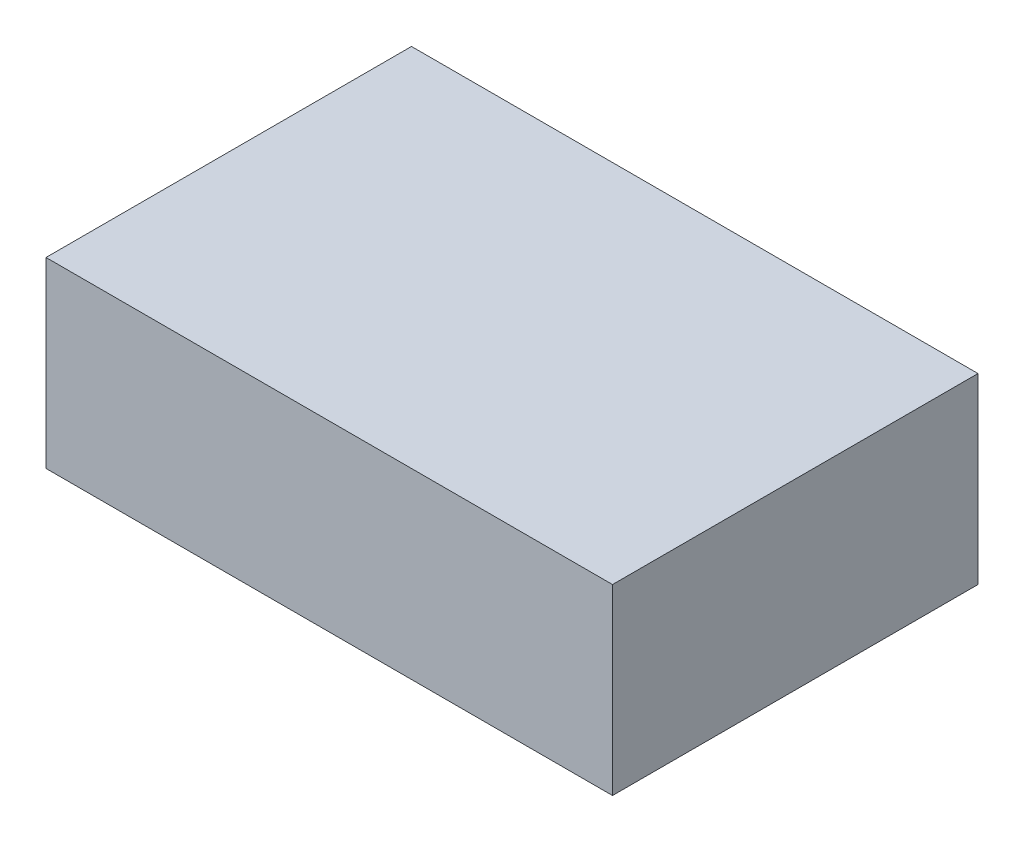
ISO-10303-21;
HEADER;
FILE_DESCRIPTION(('STEP AP214'),'2;1');
FILE_NAME('part.step','',(''),(''),'','','');
FILE_SCHEMA(('AUTOMOTIVE_DESIGN { 1 0 10303 214 1 1 1 1 }'));
ENDSEC;
DATA;
#1=APPLICATION_CONTEXT('core data for automotive mechanical design processes');
#2=APPLICATION_PROTOCOL_DEFINITION('international standard','automotive_design',2000,#1);
#3=PRODUCT_CONTEXT('',#1,'mechanical');
#4=PRODUCT('Part','Part','',(#3));
#5=PRODUCT_RELATED_PRODUCT_CATEGORY('part','',(#4));
#6=PRODUCT_DEFINITION_FORMATION('','',#4);
#7=PRODUCT_DEFINITION_CONTEXT('part definition',#1,'design');
#8=PRODUCT_DEFINITION('design','',#6,#7);
#9=PRODUCT_DEFINITION_SHAPE('','',#8);
#10=(LENGTH_UNIT() NAMED_UNIT(*) SI_UNIT(.MILLI.,.METRE.));
#11=(NAMED_UNIT(*) PLANE_ANGLE_UNIT() SI_UNIT($,.RADIAN.));
#12=(NAMED_UNIT(*) SI_UNIT($,.STERADIAN.) SOLID_ANGLE_UNIT());
#13=UNCERTAINTY_MEASURE_WITH_UNIT(LENGTH_MEASURE(1.E-05),#10,'distance_accuracy_value','');
#14=(GEOMETRIC_REPRESENTATION_CONTEXT(3) GLOBAL_UNCERTAINTY_ASSIGNED_CONTEXT((#13)) GLOBAL_UNIT_ASSIGNED_CONTEXT((#10,
#11,#12)) REPRESENTATION_CONTEXT('',''));
#15=CARTESIAN_POINT('',(0.,0.,0.));
#16=DIRECTION('',(0.,0.,1.));
#17=DIRECTION('',(1.,0.,0.));
#18=AXIS2_PLACEMENT_3D('',#15,#16,#17);
#19=CARTESIAN_POINT('',(0.,-10.,0.));
#20=DIRECTION('',(-1.,0.,0.));
#21=DIRECTION('',(0.,0.,1.));
#22=AXIS2_PLACEMENT_3D('',#19,#20,#21);
#23=PLANE('',#22);
#24=DIRECTION('',(0.,0.,1.));
#25=VECTOR('',#24,1.);
#26=CARTESIAN_POINT('',(0.,0.,0.));
#27=LINE('',#26,#25);
#28=CARTESIAN_POINT('',(0.,0.,-20.));
#29=VERTEX_POINT('',#28);
#30=CARTESIAN_POINT('',(0.,0.,0.));
#31=VERTEX_POINT('',#30);
#32=EDGE_CURVE('E104',#29,#31,#27,.T.);
#33=ORIENTED_EDGE('',*,*,#32,.F.);
#34=DIRECTION('',(0.,1.,0.));
#35=VECTOR('',#34,1.);
#36=CARTESIAN_POINT('',(0.,-10.,-20.));
#37=LINE('',#36,#35);
#38=CARTESIAN_POINT('',(0.,-10.,-20.));
#39=VERTEX_POINT('',#38);
#40=EDGE_CURVE('E11',#39,#29,#37,.T.);
#41=ORIENTED_EDGE('',*,*,#40,.F.);
#42=DIRECTION('',(0.,0.,1.));
#43=VECTOR('',#42,1.);
#44=CARTESIAN_POINT('',(0.,-10.,0.));
#45=LINE('',#44,#43);
#46=CARTESIAN_POINT('',(0.,-10.,0.));
#47=VERTEX_POINT('',#46);
#48=EDGE_CURVE('E100',#39,#47,#45,.T.);
#49=ORIENTED_EDGE('',*,*,#48,.T.);
#50=DIRECTION('',(0.,1.,0.));
#51=VECTOR('',#50,1.);
#52=CARTESIAN_POINT('',(0.,-10.,0.));
#53=LINE('',#52,#51);
#54=EDGE_CURVE('E45',#47,#31,#53,.T.);
#55=ORIENTED_EDGE('',*,*,#54,.T.);
#56=EDGE_LOOP('',(#33,#41,#49,#55));
#57=FACE_BOUND('',#56,.T.);
#58=ADVANCED_FACE('F39',(#57),#23,.T.);
#59=CARTESIAN_POINT('',(0.,-10.,-20.));
#60=DIRECTION('',(0.,0.,-1.));
#61=DIRECTION('',(-1.,0.,0.));
#62=AXIS2_PLACEMENT_3D('',#59,#60,#61);
#63=PLANE('',#62);
#64=DIRECTION('',(-1.,0.,0.));
#65=VECTOR('',#64,1.);
#66=CARTESIAN_POINT('',(0.,0.,-20.));
#67=LINE('',#66,#65);
#68=CARTESIAN_POINT('',(31.,0.,-20.));
#69=VERTEX_POINT('',#68);
#70=EDGE_CURVE('E98',#69,#29,#67,.T.);
#71=ORIENTED_EDGE('',*,*,#70,.F.);
#72=DIRECTION('',(0.,1.,0.));
#73=VECTOR('',#72,1.);
#74=CARTESIAN_POINT('',(31.,-10.,-20.));
#75=LINE('',#74,#73);
#76=CARTESIAN_POINT('',(31.,-10.,-20.));
#77=VERTEX_POINT('',#76);
#78=EDGE_CURVE('E48',#77,#69,#75,.T.);
#79=ORIENTED_EDGE('',*,*,#78,.F.);
#80=DIRECTION('',(-1.,0.,0.));
#81=VECTOR('',#80,1.);
#82=CARTESIAN_POINT('',(0.,-10.,-20.));
#83=LINE('',#82,#81);
#84=EDGE_CURVE('E92',#77,#39,#83,.T.);
#85=ORIENTED_EDGE('',*,*,#84,.T.);
#86=ORIENTED_EDGE('',*,*,#40,.T.);
#87=EDGE_LOOP('',(#71,#79,#85,#86));
#88=FACE_BOUND('',#87,.T.);
#89=ADVANCED_FACE('F111',(#88),#63,.T.);
#90=CARTESIAN_POINT('',(31.,-10.,0.));
#91=DIRECTION('',(1.,0.,0.));
#92=DIRECTION('',(0.,0.,-1.));
#93=AXIS2_PLACEMENT_3D('',#90,#91,#92);
#94=PLANE('',#93);
#95=DIRECTION('',(0.,0.,-1.));
#96=VECTOR('',#95,1.);
#97=CARTESIAN_POINT('',(31.,0.,0.));
#98=LINE('',#97,#96);
#99=CARTESIAN_POINT('',(31.,0.,0.));
#100=VERTEX_POINT('',#99);
#101=EDGE_CURVE('E87',#100,#69,#98,.T.);
#102=ORIENTED_EDGE('',*,*,#101,.F.);
#103=DIRECTION('',(0.,1.,0.));
#104=VECTOR('',#103,1.);
#105=CARTESIAN_POINT('',(31.,-10.,0.));
#106=LINE('',#105,#104);
#107=CARTESIAN_POINT('',(31.,-10.,0.));
#108=VERTEX_POINT('',#107);
#109=EDGE_CURVE('E84',#108,#100,#106,.T.);
#110=ORIENTED_EDGE('',*,*,#109,.F.);
#111=DIRECTION('',(0.,0.,-1.));
#112=VECTOR('',#111,1.);
#113=CARTESIAN_POINT('',(31.,-10.,0.));
#114=LINE('',#113,#112);
#115=EDGE_CURVE('E90',#108,#77,#114,.T.);
#116=ORIENTED_EDGE('',*,*,#115,.T.);
#117=ORIENTED_EDGE('',*,*,#78,.T.);
#118=EDGE_LOOP('',(#102,#110,#116,#117));
#119=FACE_BOUND('',#118,.T.);
#120=ADVANCED_FACE('F86',(#119),#94,.T.);
#121=CARTESIAN_POINT('',(0.,-10.,0.));
#122=DIRECTION('',(0.,0.,1.));
#123=DIRECTION('',(1.,0.,0.));
#124=AXIS2_PLACEMENT_3D('',#121,#122,#123);
#125=PLANE('',#124);
#126=DIRECTION('',(1.,0.,0.));
#127=VECTOR('',#126,1.);
#128=CARTESIAN_POINT('',(0.,0.,0.));
#129=LINE('',#128,#127);
#130=EDGE_CURVE('E106',#31,#100,#129,.T.);
#131=ORIENTED_EDGE('',*,*,#130,.F.);
#132=ORIENTED_EDGE('',*,*,#54,.F.);
#133=DIRECTION('',(1.,0.,0.));
#134=VECTOR('',#133,1.);
#135=CARTESIAN_POINT('',(0.,-10.,0.));
#136=LINE('',#135,#134);
#137=EDGE_CURVE('E93',#47,#108,#136,.T.);
#138=ORIENTED_EDGE('',*,*,#137,.T.);
#139=ORIENTED_EDGE('',*,*,#109,.T.);
#140=EDGE_LOOP('',(#131,#132,#138,#139));
#141=FACE_BOUND('',#140,.T.);
#142=ADVANCED_FACE('F96',(#141),#125,.T.);
#143=CARTESIAN_POINT('',(0.,-10.,0.));
#144=DIRECTION('',(0.,-1.,0.));
#145=DIRECTION('',(0.,0.,-1.));
#146=AXIS2_PLACEMENT_3D('',#143,#144,#145);
#147=PLANE('',#146);
#148=ORIENTED_EDGE('',*,*,#48,.F.);
#149=ORIENTED_EDGE('',*,*,#84,.F.);
#150=ORIENTED_EDGE('',*,*,#115,.F.);
#151=ORIENTED_EDGE('',*,*,#137,.F.);
#152=EDGE_LOOP('',(#148,#149,#150,#151));
#153=FACE_BOUND('',#152,.T.);
#154=ADVANCED_FACE('F95',(#153),#147,.T.);
#155=CARTESIAN_POINT('',(0.,0.,0.));
#156=DIRECTION('',(0.,-1.,0.));
#157=DIRECTION('',(0.,0.,-1.));
#158=AXIS2_PLACEMENT_3D('',#155,#156,#157);
#159=PLANE('',#158);
#160=ORIENTED_EDGE('',*,*,#32,.T.);
#161=ORIENTED_EDGE('',*,*,#130,.T.);
#162=ORIENTED_EDGE('',*,*,#101,.T.);
#163=ORIENTED_EDGE('',*,*,#70,.T.);
#164=EDGE_LOOP('',(#160,#161,#162,#163));
#165=FACE_BOUND('',#164,.T.);
#166=ADVANCED_FACE('F115',(#165),#159,.F.);
#167=CLOSED_SHELL('',(#58,#89,#120,#142,#154,#166));
#168=MANIFOLD_SOLID_BREP('B2',#167);
#169=ADVANCED_BREP_SHAPE_REPRESENTATION('',(#18,#168),#14);
#170=SHAPE_DEFINITION_REPRESENTATION(#9,#169);
ENDSEC;
END-ISO-10303-21;
